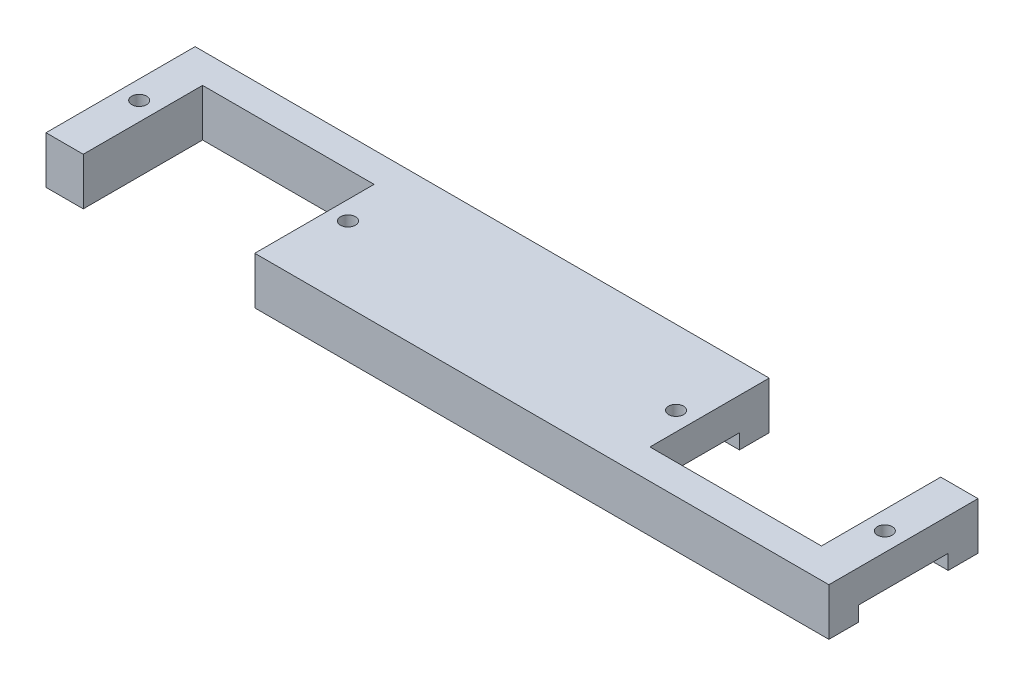
ISO-10303-21;
HEADER;
FILE_DESCRIPTION(('STEP AP214'),'2;1');
FILE_NAME('part.step','',(''),(''),'','','');
FILE_SCHEMA(('AUTOMOTIVE_DESIGN { 1 0 10303 214 1 1 1 1 }'));
ENDSEC;
DATA;
#1=APPLICATION_CONTEXT('core data for automotive mechanical design processes');
#2=APPLICATION_PROTOCOL_DEFINITION('international standard','automotive_design',2000,#1);
#3=PRODUCT_CONTEXT('',#1,'mechanical');
#4=PRODUCT('Part','Part','',(#3));
#5=PRODUCT_RELATED_PRODUCT_CATEGORY('part','',(#4));
#6=PRODUCT_DEFINITION_FORMATION('','',#4);
#7=PRODUCT_DEFINITION_CONTEXT('part definition',#1,'design');
#8=PRODUCT_DEFINITION('design','',#6,#7);
#9=PRODUCT_DEFINITION_SHAPE('','',#8);
#10=(LENGTH_UNIT() NAMED_UNIT(*) SI_UNIT(.MILLI.,.METRE.));
#11=(NAMED_UNIT(*) PLANE_ANGLE_UNIT() SI_UNIT($,.RADIAN.));
#12=(NAMED_UNIT(*) SI_UNIT($,.STERADIAN.) SOLID_ANGLE_UNIT());
#13=UNCERTAINTY_MEASURE_WITH_UNIT(LENGTH_MEASURE(1.E-05),#10,'distance_accuracy_value','');
#14=(GEOMETRIC_REPRESENTATION_CONTEXT(3) GLOBAL_UNCERTAINTY_ASSIGNED_CONTEXT((#13)) GLOBAL_UNIT_ASSIGNED_CONTEXT((#10,
#11,#12)) REPRESENTATION_CONTEXT('',''));
#15=CARTESIAN_POINT('',(0.,0.,0.));
#16=DIRECTION('',(0.,0.,1.));
#17=DIRECTION('',(1.,0.,0.));
#18=AXIS2_PLACEMENT_3D('',#15,#16,#17);
#19=CARTESIAN_POINT('',(0.,0.,0.));
#20=DIRECTION('',(0.,1.,0.));
#21=DIRECTION('',(0.,0.,1.));
#22=AXIS2_PLACEMENT_3D('',#19,#20,#21);
#23=PLANE('',#22);
#24=CARTESIAN_POINT('',(-50.,0.,0.));
#25=DIRECTION('',(0.,1.,0.));
#26=DIRECTION('',(0.,0.,1.));
#27=AXIS2_PLACEMENT_3D('',#24,#25,#26);
#28=CIRCLE('',#27,1.);
#29=CARTESIAN_POINT('',(-50.,0.,1.));
#30=VERTEX_POINT('',#29);
#31=EDGE_CURVE('E620',#30,#30,#28,.T.);
#32=ORIENTED_EDGE('',*,*,#31,.T.);
#33=EDGE_LOOP('',(#32));
#34=FACE_BOUND('',#33,.T.);
#35=CARTESIAN_POINT('',(-22.,0.,0.));
#36=DIRECTION('',(0.,1.,0.));
#37=DIRECTION('',(0.,0.,1.));
#38=AXIS2_PLACEMENT_3D('',#35,#36,#37);
#39=CIRCLE('',#38,0.999999999999997);
#40=CARTESIAN_POINT('',(-22.,0.,0.999999999999997));
#41=VERTEX_POINT('',#40);
#42=EDGE_CURVE('E633',#41,#41,#39,.T.);
#43=ORIENTED_EDGE('',*,*,#42,.T.);
#44=EDGE_LOOP('',(#43));
#45=FACE_BOUND('',#44,.T.);
#46=DIRECTION('',(0.,0.,1.));
#47=VECTOR('',#46,1.);
#48=CARTESIAN_POINT('',(24.5,0.,-10.));
#49=LINE('',#48,#47);
#50=CARTESIAN_POINT('',(24.5,0.,-10.));
#51=VERTEX_POINT('',#50);
#52=CARTESIAN_POINT('',(24.5,0.,-6.));
#53=VERTEX_POINT('',#52);
#54=EDGE_CURVE('E272',#51,#53,#49,.T.);
#55=ORIENTED_EDGE('',*,*,#54,.T.);
#56=DIRECTION('',(1.,0.,0.));
#57=VECTOR('',#56,1.);
#58=CARTESIAN_POINT('',(24.5,0.,-6.));
#59=LINE('',#58,#57);
#60=CARTESIAN_POINT('',(19.5,0.,-6.));
#61=VERTEX_POINT('',#60);
#62=EDGE_CURVE('E190',#61,#53,#59,.T.);
#63=ORIENTED_EDGE('',*,*,#62,.F.);
#64=DIRECTION('',(0.,0.,-1.));
#65=VECTOR('',#64,1.);
#66=CARTESIAN_POINT('',(19.5,0.,6.));
#67=LINE('',#66,#65);
#68=CARTESIAN_POINT('',(19.5,0.,6.));
#69=VERTEX_POINT('',#68);
#70=EDGE_CURVE('E196',#69,#61,#67,.T.);
#71=ORIENTED_EDGE('',*,*,#70,.F.);
#72=DIRECTION('',(1.,0.,0.));
#73=VECTOR('',#72,1.);
#74=CARTESIAN_POINT('',(24.5,0.,6.));
#75=LINE('',#74,#73);
#76=CARTESIAN_POINT('',(52.5,0.,6.));
#77=VERTEX_POINT('',#76);
#78=EDGE_CURVE('E172',#69,#77,#75,.T.);
#79=ORIENTED_EDGE('',*,*,#78,.T.);
#80=DIRECTION('',(0.,0.,-1.));
#81=VECTOR('',#80,1.);
#82=CARTESIAN_POINT('',(52.5,0.,-10.));
#83=LINE('',#82,#81);
#84=CARTESIAN_POINT('',(52.5,0.,10.));
#85=VERTEX_POINT('',#84);
#86=EDGE_CURVE('E321',#85,#77,#83,.T.);
#87=ORIENTED_EDGE('',*,*,#86,.F.);
#88=DIRECTION('',(1.,0.,0.));
#89=VECTOR('',#88,1.);
#90=CARTESIAN_POINT('',(-52.5,0.,10.));
#91=LINE('',#90,#89);
#92=CARTESIAN_POINT('',(-24.5,0.,10.));
#93=VERTEX_POINT('',#92);
#94=EDGE_CURVE('E333',#93,#85,#91,.T.);
#95=ORIENTED_EDGE('',*,*,#94,.F.);
#96=DIRECTION('',(0.,0.,-1.));
#97=VECTOR('',#96,1.);
#98=CARTESIAN_POINT('',(-24.5,0.,10.));
#99=LINE('',#98,#97);
#100=CARTESIAN_POINT('',(-24.5,0.,-6.));
#101=VERTEX_POINT('',#100);
#102=EDGE_CURVE('E240',#93,#101,#99,.T.);
#103=ORIENTED_EDGE('',*,*,#102,.T.);
#104=DIRECTION('',(-1.,0.,0.));
#105=VECTOR('',#104,1.);
#106=CARTESIAN_POINT('',(-47.5,0.,-6.));
#107=LINE('',#106,#105);
#108=CARTESIAN_POINT('',(-47.5,0.,-6.));
#109=VERTEX_POINT('',#108);
#110=EDGE_CURVE('E62',#101,#109,#107,.T.);
#111=ORIENTED_EDGE('',*,*,#110,.T.);
#112=DIRECTION('',(0.,0.,1.));
#113=VECTOR('',#112,1.);
#114=CARTESIAN_POINT('',(-47.5,0.,10.));
#115=LINE('',#114,#113);
#116=CARTESIAN_POINT('',(-47.5,0.,10.));
#117=VERTEX_POINT('',#116);
#118=EDGE_CURVE('E236',#109,#117,#115,.T.);
#119=ORIENTED_EDGE('',*,*,#118,.T.);
#120=CARTESIAN_POINT('',(-52.5,0.,10.));
#121=VERTEX_POINT('',#120);
#122=EDGE_CURVE('E307',#121,#117,#91,.T.);
#123=ORIENTED_EDGE('',*,*,#122,.F.);
#124=DIRECTION('',(0.,0.,1.));
#125=VECTOR('',#124,1.);
#126=CARTESIAN_POINT('',(-52.5,0.,-10.));
#127=LINE('',#126,#125);
#128=CARTESIAN_POINT('',(-52.5,0.,-10.));
#129=VERTEX_POINT('',#128);
#130=EDGE_CURVE('E330',#129,#121,#127,.T.);
#131=ORIENTED_EDGE('',*,*,#130,.F.);
#132=DIRECTION('',(-1.,0.,0.));
#133=VECTOR('',#132,1.);
#134=CARTESIAN_POINT('',(-52.5,0.,-10.));
#135=LINE('',#134,#133);
#136=EDGE_CURVE('E325',#51,#129,#135,.T.);
#137=ORIENTED_EDGE('',*,*,#136,.F.);
#138=EDGE_LOOP('',(#55,#63,#71,#79,#87,#95,#103,#111,#119,#123,#131,#137));
#139=FACE_BOUND('',#138,.T.);
#140=ADVANCED_FACE('F38',(#34,#45,#139),#23,.F.);
#141=CARTESIAN_POINT('',(-52.5,6.35,-10.));
#142=DIRECTION('',(0.,0.,1.));
#143=DIRECTION('',(1.,0.,0.));
#144=AXIS2_PLACEMENT_3D('',#141,#142,#143);
#145=PLANE('',#144);
#146=DIRECTION('',(-1.,0.,0.));
#147=VECTOR('',#146,1.);
#148=CARTESIAN_POINT('',(-52.5,6.35,-10.));
#149=LINE('',#148,#147);
#150=CARTESIAN_POINT('',(24.5,6.35,-10.));
#151=VERTEX_POINT('',#150);
#152=CARTESIAN_POINT('',(-52.5,6.35,-10.));
#153=VERTEX_POINT('',#152);
#154=EDGE_CURVE('E306',#151,#153,#149,.T.);
#155=ORIENTED_EDGE('',*,*,#154,.F.);
#156=DIRECTION('',(0.,1.,0.));
#157=VECTOR('',#156,1.);
#158=CARTESIAN_POINT('',(24.5,0.,-10.));
#159=LINE('',#158,#157);
#160=EDGE_CURVE('E252',#51,#151,#159,.T.);
#161=ORIENTED_EDGE('',*,*,#160,.F.);
#162=ORIENTED_EDGE('',*,*,#136,.T.);
#163=DIRECTION('',(0.,-1.,0.));
#164=VECTOR('',#163,1.);
#165=CARTESIAN_POINT('',(-52.5,6.35,-10.));
#166=LINE('',#165,#164);
#167=EDGE_CURVE('E47',#153,#129,#166,.T.);
#168=ORIENTED_EDGE('',*,*,#167,.F.);
#169=EDGE_LOOP('',(#155,#161,#162,#168));
#170=FACE_BOUND('',#169,.T.);
#171=ADVANCED_FACE('F405',(#170),#145,.F.);
#172=CARTESIAN_POINT('',(-52.5,6.35,10.));
#173=DIRECTION('',(0.,0.,-1.));
#174=DIRECTION('',(-1.,0.,0.));
#175=AXIS2_PLACEMENT_3D('',#172,#173,#174);
#176=PLANE('',#175);
#177=ORIENTED_EDGE('',*,*,#122,.T.);
#178=DIRECTION('',(0.,1.,0.));
#179=VECTOR('',#178,1.);
#180=CARTESIAN_POINT('',(-47.5,0.,10.));
#181=LINE('',#180,#179);
#182=CARTESIAN_POINT('',(-47.5,6.35,10.));
#183=VERTEX_POINT('',#182);
#184=EDGE_CURVE('E247',#117,#183,#181,.T.);
#185=ORIENTED_EDGE('',*,*,#184,.T.);
#186=DIRECTION('',(1.,0.,0.));
#187=VECTOR('',#186,1.);
#188=CARTESIAN_POINT('',(-52.5,6.35,10.));
#189=LINE('',#188,#187);
#190=CARTESIAN_POINT('',(-52.5,6.35,10.));
#191=VERTEX_POINT('',#190);
#192=EDGE_CURVE('E316',#191,#183,#189,.T.);
#193=ORIENTED_EDGE('',*,*,#192,.F.);
#194=DIRECTION('',(0.,-1.,0.));
#195=VECTOR('',#194,1.);
#196=CARTESIAN_POINT('',(-52.5,6.35,10.));
#197=LINE('',#196,#195);
#198=EDGE_CURVE('E340',#191,#121,#197,.T.);
#199=ORIENTED_EDGE('',*,*,#198,.T.);
#200=EDGE_LOOP('',(#177,#185,#193,#199));
#201=FACE_BOUND('',#200,.T.);
#202=ADVANCED_FACE('F358',(#201),#176,.F.);
#203=CARTESIAN_POINT('',(52.5,6.35,-10.));
#204=DIRECTION('',(-1.,0.,0.));
#205=DIRECTION('',(0.,0.,1.));
#206=AXIS2_PLACEMENT_3D('',#203,#204,#205);
#207=PLANE('',#206);
#208=ORIENTED_EDGE('',*,*,#86,.T.);
#209=DIRECTION('',(0.,-1.,0.));
#210=VECTOR('',#209,1.);
#211=CARTESIAN_POINT('',(52.5,2.,6.));
#212=LINE('',#211,#210);
#213=CARTESIAN_POINT('',(52.5,2.,6.));
#214=VERTEX_POINT('',#213);
#215=EDGE_CURVE('E199',#214,#77,#212,.T.);
#216=ORIENTED_EDGE('',*,*,#215,.F.);
#217=DIRECTION('',(0.,0.,1.));
#218=VECTOR('',#217,1.);
#219=CARTESIAN_POINT('',(52.5,2.,6.));
#220=LINE('',#219,#218);
#221=CARTESIAN_POINT('',(52.5,2.,-6.));
#222=VERTEX_POINT('',#221);
#223=EDGE_CURVE('E218',#222,#214,#220,.T.);
#224=ORIENTED_EDGE('',*,*,#223,.F.);
#225=DIRECTION('',(0.,-1.,0.));
#226=VECTOR('',#225,1.);
#227=CARTESIAN_POINT('',(52.5,2.,-6.));
#228=LINE('',#227,#226);
#229=CARTESIAN_POINT('',(52.5,0.,-6.));
#230=VERTEX_POINT('',#229);
#231=EDGE_CURVE('E230',#222,#230,#228,.T.);
#232=ORIENTED_EDGE('',*,*,#231,.T.);
#233=CARTESIAN_POINT('',(52.5,0.,-10.));
#234=VERTEX_POINT('',#233);
#235=EDGE_CURVE('E262',#230,#234,#83,.T.);
#236=ORIENTED_EDGE('',*,*,#235,.T.);
#237=DIRECTION('',(0.,-1.,0.));
#238=VECTOR('',#237,1.);
#239=CARTESIAN_POINT('',(52.5,6.35,-10.));
#240=LINE('',#239,#238);
#241=CARTESIAN_POINT('',(52.5,6.35,-10.));
#242=VERTEX_POINT('',#241);
#243=EDGE_CURVE('E11',#242,#234,#240,.T.);
#244=ORIENTED_EDGE('',*,*,#243,.F.);
#245=DIRECTION('',(0.,0.,-1.));
#246=VECTOR('',#245,1.);
#247=CARTESIAN_POINT('',(52.5,6.35,-10.));
#248=LINE('',#247,#246);
#249=CARTESIAN_POINT('',(52.5,6.35,10.));
#250=VERTEX_POINT('',#249);
#251=EDGE_CURVE('E302',#250,#242,#248,.T.);
#252=ORIENTED_EDGE('',*,*,#251,.F.);
#253=DIRECTION('',(0.,-1.,0.));
#254=VECTOR('',#253,1.);
#255=CARTESIAN_POINT('',(52.5,6.35,10.));
#256=LINE('',#255,#254);
#257=EDGE_CURVE('E320',#250,#85,#256,.T.);
#258=ORIENTED_EDGE('',*,*,#257,.T.);
#259=EDGE_LOOP('',(#208,#216,#224,#232,#236,#244,#252,#258));
#260=FACE_BOUND('',#259,.T.);
#261=ADVANCED_FACE('F40',(#260),#207,.F.);
#262=CARTESIAN_POINT('',(47.5,0.,-10.));
#263=VERTEX_POINT('',#262);
#264=EDGE_CURVE('E326',#234,#263,#135,.T.);
#265=ORIENTED_EDGE('',*,*,#264,.T.);
#266=DIRECTION('',(0.,1.,0.));
#267=VECTOR('',#266,1.);
#268=CARTESIAN_POINT('',(47.5,0.,-10.));
#269=LINE('',#268,#267);
#270=CARTESIAN_POINT('',(47.5,6.35,-10.));
#271=VERTEX_POINT('',#270);
#272=EDGE_CURVE('E293',#263,#271,#269,.T.);
#273=ORIENTED_EDGE('',*,*,#272,.T.);
#274=EDGE_CURVE('E308',#242,#271,#149,.T.);
#275=ORIENTED_EDGE('',*,*,#274,.F.);
#276=ORIENTED_EDGE('',*,*,#243,.T.);
#277=EDGE_LOOP('',(#265,#273,#275,#276));
#278=FACE_BOUND('',#277,.T.);
#279=ADVANCED_FACE('F383',(#278),#145,.F.);
#280=CARTESIAN_POINT('',(-52.5,6.35,-10.));
#281=DIRECTION('',(1.,0.,0.));
#282=DIRECTION('',(0.,0.,-1.));
#283=AXIS2_PLACEMENT_3D('',#280,#281,#282);
#284=PLANE('',#283);
#285=ORIENTED_EDGE('',*,*,#130,.T.);
#286=ORIENTED_EDGE('',*,*,#198,.F.);
#287=DIRECTION('',(0.,0.,1.));
#288=VECTOR('',#287,1.);
#289=CARTESIAN_POINT('',(-52.5,6.35,-10.));
#290=LINE('',#289,#288);
#291=EDGE_CURVE('E312',#153,#191,#290,.T.);
#292=ORIENTED_EDGE('',*,*,#291,.F.);
#293=ORIENTED_EDGE('',*,*,#167,.T.);
#294=EDGE_LOOP('',(#285,#286,#292,#293));
#295=FACE_BOUND('',#294,.T.);
#296=ADVANCED_FACE('F349',(#295),#284,.F.);
#297=CARTESIAN_POINT('',(-24.5,6.35,10.));
#298=VERTEX_POINT('',#297);
#299=EDGE_CURVE('E315',#298,#250,#189,.T.);
#300=ORIENTED_EDGE('',*,*,#299,.F.);
#301=DIRECTION('',(0.,1.,0.));
#302=VECTOR('',#301,1.);
#303=CARTESIAN_POINT('',(-24.5,0.,10.));
#304=LINE('',#303,#302);
#305=EDGE_CURVE('E266',#93,#298,#304,.T.);
#306=ORIENTED_EDGE('',*,*,#305,.F.);
#307=ORIENTED_EDGE('',*,*,#94,.T.);
#308=ORIENTED_EDGE('',*,*,#257,.F.);
#309=EDGE_LOOP('',(#300,#306,#307,#308));
#310=FACE_BOUND('',#309,.T.);
#311=ADVANCED_FACE('F412',(#310),#176,.F.);
#312=CARTESIAN_POINT('',(0.,6.35,0.));
#313=DIRECTION('',(0.,1.,0.));
#314=DIRECTION('',(0.,0.,1.));
#315=AXIS2_PLACEMENT_3D('',#312,#313,#314);
#316=PLANE('',#315);
#317=CARTESIAN_POINT('',(-50.,6.35,0.));
#318=DIRECTION('',(0.,1.,0.));
#319=DIRECTION('',(0.,0.,1.));
#320=AXIS2_PLACEMENT_3D('',#317,#318,#319);
#321=CIRCLE('',#320,1.);
#322=CARTESIAN_POINT('',(-50.,6.35,1.));
#323=VERTEX_POINT('',#322);
#324=EDGE_CURVE('E623',#323,#323,#321,.T.);
#325=ORIENTED_EDGE('',*,*,#324,.F.);
#326=EDGE_LOOP('',(#325));
#327=FACE_BOUND('',#326,.T.);
#328=CARTESIAN_POINT('',(-22.,6.35,0.));
#329=DIRECTION('',(0.,1.,0.));
#330=DIRECTION('',(0.,0.,1.));
#331=AXIS2_PLACEMENT_3D('',#328,#329,#330);
#332=CIRCLE('',#331,1.);
#333=CARTESIAN_POINT('',(-22.,6.35,1.));
#334=VERTEX_POINT('',#333);
#335=EDGE_CURVE('E627',#334,#334,#332,.T.);
#336=ORIENTED_EDGE('',*,*,#335,.F.);
#337=EDGE_LOOP('',(#336));
#338=FACE_BOUND('',#337,.T.);
#339=CARTESIAN_POINT('',(22.,6.35,0.));
#340=DIRECTION('',(0.,1.,0.));
#341=DIRECTION('',(0.,0.,1.));
#342=AXIS2_PLACEMENT_3D('',#339,#340,#341);
#343=CIRCLE('',#342,1.);
#344=CARTESIAN_POINT('',(22.,6.35,1.));
#345=VERTEX_POINT('',#344);
#346=EDGE_CURVE('E637',#345,#345,#343,.T.);
#347=ORIENTED_EDGE('',*,*,#346,.F.);
#348=EDGE_LOOP('',(#347));
#349=FACE_BOUND('',#348,.T.);
#350=CARTESIAN_POINT('',(50.,6.35,0.));
#351=DIRECTION('',(0.,1.,0.));
#352=DIRECTION('',(0.,0.,1.));
#353=AXIS2_PLACEMENT_3D('',#350,#351,#352);
#354=CIRCLE('',#353,1.);
#355=CARTESIAN_POINT('',(50.,6.35,1.));
#356=VERTEX_POINT('',#355);
#357=EDGE_CURVE('E645',#356,#356,#354,.T.);
#358=ORIENTED_EDGE('',*,*,#357,.F.);
#359=EDGE_LOOP('',(#358));
#360=FACE_BOUND('',#359,.T.);
#361=DIRECTION('',(0.,0.,1.));
#362=VECTOR('',#361,1.);
#363=CARTESIAN_POINT('',(-47.5,6.35,10.));
#364=LINE('',#363,#362);
#365=CARTESIAN_POINT('',(-47.5,6.35,-6.));
#366=VERTEX_POINT('',#365);
#367=EDGE_CURVE('E248',#366,#183,#364,.T.);
#368=ORIENTED_EDGE('',*,*,#367,.F.);
#369=DIRECTION('',(-1.,0.,0.));
#370=VECTOR('',#369,1.);
#371=CARTESIAN_POINT('',(-47.5,6.35,-6.));
#372=LINE('',#371,#370);
#373=CARTESIAN_POINT('',(-24.5,6.35,-6.));
#374=VERTEX_POINT('',#373);
#375=EDGE_CURVE('E241',#374,#366,#372,.T.);
#376=ORIENTED_EDGE('',*,*,#375,.F.);
#377=DIRECTION('',(0.,0.,-1.));
#378=VECTOR('',#377,1.);
#379=CARTESIAN_POINT('',(-24.5,6.35,10.));
#380=LINE('',#379,#378);
#381=EDGE_CURVE('E251',#298,#374,#380,.T.);
#382=ORIENTED_EDGE('',*,*,#381,.F.);
#383=ORIENTED_EDGE('',*,*,#299,.T.);
#384=ORIENTED_EDGE('',*,*,#251,.T.);
#385=ORIENTED_EDGE('',*,*,#274,.T.);
#386=DIRECTION('',(0.,0.,-1.));
#387=VECTOR('',#386,1.);
#388=CARTESIAN_POINT('',(47.5,6.35,-10.));
#389=LINE('',#388,#387);
#390=CARTESIAN_POINT('',(47.5,6.35,6.));
#391=VERTEX_POINT('',#390);
#392=EDGE_CURVE('E276',#391,#271,#389,.T.);
#393=ORIENTED_EDGE('',*,*,#392,.F.);
#394=DIRECTION('',(1.,0.,0.));
#395=VECTOR('',#394,1.);
#396=CARTESIAN_POINT('',(24.5,6.35,6.));
#397=LINE('',#396,#395);
#398=CARTESIAN_POINT('',(24.5,6.35,6.));
#399=VERTEX_POINT('',#398);
#400=EDGE_CURVE('E286',#399,#391,#397,.T.);
#401=ORIENTED_EDGE('',*,*,#400,.F.);
#402=DIRECTION('',(0.,0.,1.));
#403=VECTOR('',#402,1.);
#404=CARTESIAN_POINT('',(24.5,6.35,-10.));
#405=LINE('',#404,#403);
#406=EDGE_CURVE('E206',#151,#399,#405,.T.);
#407=ORIENTED_EDGE('',*,*,#406,.F.);
#408=ORIENTED_EDGE('',*,*,#154,.T.);
#409=ORIENTED_EDGE('',*,*,#291,.T.);
#410=ORIENTED_EDGE('',*,*,#192,.T.);
#411=EDGE_LOOP('',(#368,#376,#382,#383,#384,#385,#393,#401,#407,#408,#409,#410));
#412=FACE_BOUND('',#411,.T.);
#413=ADVANCED_FACE('F362',(#327,#338,#349,#360,#412),#316,.T.);
#414=ORIENTED_EDGE('',*,*,#235,.F.);
#415=DIRECTION('',(1.,0.,0.));
#416=VECTOR('',#415,1.);
#417=CARTESIAN_POINT('',(47.5,0.,-6.));
#418=LINE('',#417,#416);
#419=CARTESIAN_POINT('',(47.5,0.,-6.));
#420=VERTEX_POINT('',#419);
#421=EDGE_CURVE('E214',#420,#230,#418,.T.);
#422=ORIENTED_EDGE('',*,*,#421,.F.);
#423=DIRECTION('',(0.,0.,-1.));
#424=VECTOR('',#423,1.);
#425=CARTESIAN_POINT('',(47.5,0.,-10.));
#426=LINE('',#425,#424);
#427=EDGE_CURVE('E279',#420,#263,#426,.T.);
#428=ORIENTED_EDGE('',*,*,#427,.T.);
#429=ORIENTED_EDGE('',*,*,#264,.F.);
#430=EDGE_LOOP('',(#414,#422,#428,#429));
#431=FACE_BOUND('',#430,.T.);
#432=ADVANCED_FACE('F379',(#431),#23,.F.);
#433=CARTESIAN_POINT('',(24.5,0.,-10.));
#434=DIRECTION('',(-1.,0.,0.));
#435=DIRECTION('',(0.,0.,1.));
#436=AXIS2_PLACEMENT_3D('',#433,#434,#435);
#437=PLANE('',#436);
#438=DIRECTION('',(0.,0.,1.));
#439=VECTOR('',#438,1.);
#440=CARTESIAN_POINT('',(24.5,2.,6.));
#441=LINE('',#440,#439);
#442=CARTESIAN_POINT('',(24.5,2.,-6.));
#443=VERTEX_POINT('',#442);
#444=CARTESIAN_POINT('',(24.5,2.,6.));
#445=VERTEX_POINT('',#444);
#446=EDGE_CURVE('E54',#443,#445,#441,.T.);
#447=ORIENTED_EDGE('',*,*,#446,.F.);
#448=DIRECTION('',(0.,-1.,0.));
#449=VECTOR('',#448,1.);
#450=CARTESIAN_POINT('',(24.5,2.,-6.));
#451=LINE('',#450,#449);
#452=EDGE_CURVE('E202',#443,#53,#451,.T.);
#453=ORIENTED_EDGE('',*,*,#452,.T.);
#454=ORIENTED_EDGE('',*,*,#54,.F.);
#455=ORIENTED_EDGE('',*,*,#160,.T.);
#456=ORIENTED_EDGE('',*,*,#406,.T.);
#457=DIRECTION('',(0.,1.,0.));
#458=VECTOR('',#457,1.);
#459=CARTESIAN_POINT('',(24.5,0.,6.));
#460=LINE('',#459,#458);
#461=EDGE_CURVE('E282',#445,#399,#460,.T.);
#462=ORIENTED_EDGE('',*,*,#461,.F.);
#463=EDGE_LOOP('',(#447,#453,#454,#455,#456,#462));
#464=FACE_BOUND('',#463,.T.);
#465=ADVANCED_FACE('F404',(#464),#437,.F.);
#466=CARTESIAN_POINT('',(47.5,0.,-10.));
#467=DIRECTION('',(1.,0.,0.));
#468=DIRECTION('',(0.,0.,-1.));
#469=AXIS2_PLACEMENT_3D('',#466,#467,#468);
#470=PLANE('',#469);
#471=ORIENTED_EDGE('',*,*,#427,.F.);
#472=DIRECTION('',(0.,-1.,0.));
#473=VECTOR('',#472,1.);
#474=CARTESIAN_POINT('',(47.5,2.,-6.));
#475=LINE('',#474,#473);
#476=CARTESIAN_POINT('',(47.5,2.,-6.));
#477=VERTEX_POINT('',#476);
#478=EDGE_CURVE('E224',#477,#420,#475,.T.);
#479=ORIENTED_EDGE('',*,*,#478,.F.);
#480=DIRECTION('',(0.,0.,-1.));
#481=VECTOR('',#480,1.);
#482=CARTESIAN_POINT('',(47.5,2.,6.));
#483=LINE('',#482,#481);
#484=CARTESIAN_POINT('',(47.5,2.,6.));
#485=VERTEX_POINT('',#484);
#486=EDGE_CURVE('E209',#485,#477,#483,.T.);
#487=ORIENTED_EDGE('',*,*,#486,.F.);
#488=DIRECTION('',(0.,1.,0.));
#489=VECTOR('',#488,1.);
#490=CARTESIAN_POINT('',(47.5,0.,6.));
#491=LINE('',#490,#489);
#492=EDGE_CURVE('E297',#485,#391,#491,.T.);
#493=ORIENTED_EDGE('',*,*,#492,.T.);
#494=ORIENTED_EDGE('',*,*,#392,.T.);
#495=ORIENTED_EDGE('',*,*,#272,.F.);
#496=EDGE_LOOP('',(#471,#479,#487,#493,#494,#495));
#497=FACE_BOUND('',#496,.T.);
#498=ADVANCED_FACE('F402',(#497),#470,.F.);
#499=CARTESIAN_POINT('',(24.5,0.,6.));
#500=DIRECTION('',(0.,0.,1.));
#501=DIRECTION('',(1.,0.,0.));
#502=AXIS2_PLACEMENT_3D('',#499,#500,#501);
#503=PLANE('',#502);
#504=ORIENTED_EDGE('',*,*,#400,.T.);
#505=ORIENTED_EDGE('',*,*,#492,.F.);
#506=DIRECTION('',(-1.,0.,0.));
#507=VECTOR('',#506,1.);
#508=CARTESIAN_POINT('',(47.5,2.,6.));
#509=LINE('',#508,#507);
#510=EDGE_CURVE('E221',#214,#485,#509,.T.);
#511=ORIENTED_EDGE('',*,*,#510,.F.);
#512=ORIENTED_EDGE('',*,*,#215,.T.);
#513=ORIENTED_EDGE('',*,*,#78,.F.);
#514=DIRECTION('',(0.,-1.,0.));
#515=VECTOR('',#514,1.);
#516=CARTESIAN_POINT('',(19.5,2.,6.));
#517=LINE('',#516,#515);
#518=CARTESIAN_POINT('',(19.5,2.,6.));
#519=VERTEX_POINT('',#518);
#520=EDGE_CURVE('E165',#519,#69,#517,.T.);
#521=ORIENTED_EDGE('',*,*,#520,.F.);
#522=DIRECTION('',(-1.,0.,0.));
#523=VECTOR('',#522,1.);
#524=CARTESIAN_POINT('',(24.5,2.,6.));
#525=LINE('',#524,#523);
#526=EDGE_CURVE('E169',#445,#519,#525,.T.);
#527=ORIENTED_EDGE('',*,*,#526,.F.);
#528=ORIENTED_EDGE('',*,*,#461,.T.);
#529=EDGE_LOOP('',(#504,#505,#511,#512,#513,#521,#527,#528));
#530=FACE_BOUND('',#529,.T.);
#531=ADVANCED_FACE('F168',(#530),#503,.F.);
#532=CARTESIAN_POINT('',(-47.5,0.,10.));
#533=DIRECTION('',(-1.,0.,0.));
#534=DIRECTION('',(0.,0.,1.));
#535=AXIS2_PLACEMENT_3D('',#532,#533,#534);
#536=PLANE('',#535);
#537=ORIENTED_EDGE('',*,*,#367,.T.);
#538=ORIENTED_EDGE('',*,*,#184,.F.);
#539=ORIENTED_EDGE('',*,*,#118,.F.);
#540=DIRECTION('',(0.,1.,0.));
#541=VECTOR('',#540,1.);
#542=CARTESIAN_POINT('',(-47.5,0.,-6.));
#543=LINE('',#542,#541);
#544=EDGE_CURVE('E259',#109,#366,#543,.T.);
#545=ORIENTED_EDGE('',*,*,#544,.T.);
#546=EDGE_LOOP('',(#537,#538,#539,#545));
#547=FACE_BOUND('',#546,.T.);
#548=ADVANCED_FACE('F463',(#547),#536,.F.);
#549=CARTESIAN_POINT('',(-47.5,0.,-6.));
#550=DIRECTION('',(0.,0.,-1.));
#551=DIRECTION('',(-1.,0.,0.));
#552=AXIS2_PLACEMENT_3D('',#549,#550,#551);
#553=PLANE('',#552);
#554=ORIENTED_EDGE('',*,*,#375,.T.);
#555=ORIENTED_EDGE('',*,*,#544,.F.);
#556=ORIENTED_EDGE('',*,*,#110,.F.);
#557=DIRECTION('',(0.,1.,0.));
#558=VECTOR('',#557,1.);
#559=CARTESIAN_POINT('',(-24.5,0.,-6.));
#560=LINE('',#559,#558);
#561=EDGE_CURVE('E263',#101,#374,#560,.T.);
#562=ORIENTED_EDGE('',*,*,#561,.T.);
#563=EDGE_LOOP('',(#554,#555,#556,#562));
#564=FACE_BOUND('',#563,.T.);
#565=ADVANCED_FACE('F563',(#564),#553,.F.);
#566=CARTESIAN_POINT('',(-24.5,0.,10.));
#567=DIRECTION('',(1.,0.,0.));
#568=DIRECTION('',(0.,0.,-1.));
#569=AXIS2_PLACEMENT_3D('',#566,#567,#568);
#570=PLANE('',#569);
#571=ORIENTED_EDGE('',*,*,#381,.T.);
#572=ORIENTED_EDGE('',*,*,#561,.F.);
#573=ORIENTED_EDGE('',*,*,#102,.F.);
#574=ORIENTED_EDGE('',*,*,#305,.T.);
#575=EDGE_LOOP('',(#571,#572,#573,#574));
#576=FACE_BOUND('',#575,.T.);
#577=ADVANCED_FACE('F429',(#576),#570,.F.);
#578=CARTESIAN_POINT('',(47.5,2.,-6.));
#579=DIRECTION('',(0.,0.,-1.));
#580=DIRECTION('',(-1.,0.,0.));
#581=AXIS2_PLACEMENT_3D('',#578,#579,#580);
#582=PLANE('',#581);
#583=ORIENTED_EDGE('',*,*,#421,.T.);
#584=ORIENTED_EDGE('',*,*,#231,.F.);
#585=DIRECTION('',(1.,0.,0.));
#586=VECTOR('',#585,1.);
#587=CARTESIAN_POINT('',(47.5,2.,-6.));
#588=LINE('',#587,#586);
#589=EDGE_CURVE('E213',#477,#222,#588,.T.);
#590=ORIENTED_EDGE('',*,*,#589,.F.);
#591=ORIENTED_EDGE('',*,*,#478,.T.);
#592=EDGE_LOOP('',(#583,#584,#590,#591));
#593=FACE_BOUND('',#592,.T.);
#594=ADVANCED_FACE('F400',(#593),#582,.F.);
#595=CARTESIAN_POINT('',(0.,2.,0.));
#596=DIRECTION('',(0.,-1.,0.));
#597=DIRECTION('',(0.,0.,-1.));
#598=AXIS2_PLACEMENT_3D('',#595,#596,#597);
#599=PLANE('',#598);
#600=CARTESIAN_POINT('',(50.,2.,0.));
#601=DIRECTION('',(0.,-1.,0.));
#602=DIRECTION('',(0.,0.,-1.));
#603=AXIS2_PLACEMENT_3D('',#600,#601,#602);
#604=CIRCLE('',#603,1.);
#605=CARTESIAN_POINT('',(50.,2.,-1.));
#606=VERTEX_POINT('',#605);
#607=EDGE_CURVE('E227',#606,#606,#604,.T.);
#608=ORIENTED_EDGE('',*,*,#607,.F.);
#609=EDGE_LOOP('',(#608));
#610=FACE_BOUND('',#609,.T.);
#611=ORIENTED_EDGE('',*,*,#486,.T.);
#612=ORIENTED_EDGE('',*,*,#589,.T.);
#613=ORIENTED_EDGE('',*,*,#223,.T.);
#614=ORIENTED_EDGE('',*,*,#510,.T.);
#615=EDGE_LOOP('',(#611,#612,#613,#614));
#616=FACE_BOUND('',#615,.T.);
#617=ADVANCED_FACE('F396',(#610,#616),#599,.T.);
#618=CARTESIAN_POINT('',(24.5,2.,-6.));
#619=DIRECTION('',(0.,0.,-1.));
#620=DIRECTION('',(-1.,0.,0.));
#621=AXIS2_PLACEMENT_3D('',#618,#619,#620);
#622=PLANE('',#621);
#623=ORIENTED_EDGE('',*,*,#62,.T.);
#624=ORIENTED_EDGE('',*,*,#452,.F.);
#625=DIRECTION('',(1.,0.,0.));
#626=VECTOR('',#625,1.);
#627=CARTESIAN_POINT('',(24.5,2.,-6.));
#628=LINE('',#627,#626);
#629=CARTESIAN_POINT('',(19.5,2.,-6.));
#630=VERTEX_POINT('',#629);
#631=EDGE_CURVE('E178',#630,#443,#628,.T.);
#632=ORIENTED_EDGE('',*,*,#631,.F.);
#633=DIRECTION('',(0.,-1.,0.));
#634=VECTOR('',#633,1.);
#635=CARTESIAN_POINT('',(19.5,2.,-6.));
#636=LINE('',#635,#634);
#637=EDGE_CURVE('E177',#630,#61,#636,.T.);
#638=ORIENTED_EDGE('',*,*,#637,.T.);
#639=EDGE_LOOP('',(#623,#624,#632,#638));
#640=FACE_BOUND('',#639,.T.);
#641=ADVANCED_FACE('F480',(#640),#622,.F.);
#642=CARTESIAN_POINT('',(19.5,2.,6.));
#643=DIRECTION('',(-1.,0.,0.));
#644=DIRECTION('',(0.,0.,1.));
#645=AXIS2_PLACEMENT_3D('',#642,#643,#644);
#646=PLANE('',#645);
#647=ORIENTED_EDGE('',*,*,#70,.T.);
#648=ORIENTED_EDGE('',*,*,#637,.F.);
#649=DIRECTION('',(0.,0.,-1.));
#650=VECTOR('',#649,1.);
#651=CARTESIAN_POINT('',(19.5,2.,6.));
#652=LINE('',#651,#650);
#653=EDGE_CURVE('E181',#519,#630,#652,.T.);
#654=ORIENTED_EDGE('',*,*,#653,.F.);
#655=ORIENTED_EDGE('',*,*,#520,.T.);
#656=EDGE_LOOP('',(#647,#648,#654,#655));
#657=FACE_BOUND('',#656,.T.);
#658=ADVANCED_FACE('F182',(#657),#646,.F.);
#659=CARTESIAN_POINT('',(0.,2.,0.));
#660=DIRECTION('',(0.,1.,0.));
#661=DIRECTION('',(0.,0.,1.));
#662=AXIS2_PLACEMENT_3D('',#659,#660,#661);
#663=PLANE('',#662);
#664=CARTESIAN_POINT('',(22.,2.,0.));
#665=DIRECTION('',(0.,1.,0.));
#666=DIRECTION('',(0.,0.,1.));
#667=AXIS2_PLACEMENT_3D('',#664,#665,#666);
#668=CIRCLE('',#667,0.999999999999999);
#669=CARTESIAN_POINT('',(22.,2.,0.999999999999999));
#670=VERTEX_POINT('',#669);
#671=EDGE_CURVE('E641',#670,#670,#668,.T.);
#672=ORIENTED_EDGE('',*,*,#671,.T.);
#673=EDGE_LOOP('',(#672));
#674=FACE_BOUND('',#673,.T.);
#675=ORIENTED_EDGE('',*,*,#446,.T.);
#676=ORIENTED_EDGE('',*,*,#526,.T.);
#677=ORIENTED_EDGE('',*,*,#653,.T.);
#678=ORIENTED_EDGE('',*,*,#631,.T.);
#679=EDGE_LOOP('',(#675,#676,#677,#678));
#680=FACE_BOUND('',#679,.T.);
#681=ADVANCED_FACE('F186',(#674,#680),#663,.F.);
#682=CARTESIAN_POINT('',(50.,6.35,0.));
#683=DIRECTION('',(0.,1.,0.));
#684=DIRECTION('',(0.,0.,1.));
#685=AXIS2_PLACEMENT_3D('',#682,#683,#684);
#686=CYLINDRICAL_SURFACE('',#685,1.);
#687=ORIENTED_EDGE('',*,*,#607,.T.);
#688=EDGE_LOOP('',(#687));
#689=FACE_BOUND('',#688,.T.);
#690=ORIENTED_EDGE('',*,*,#357,.T.);
#691=EDGE_LOOP('',(#690));
#692=FACE_BOUND('',#691,.T.);
#693=ADVANCED_FACE('F518',(#689,#692),#686,.F.);
#694=CARTESIAN_POINT('',(22.,6.35,0.));
#695=DIRECTION('',(0.,1.,0.));
#696=DIRECTION('',(0.,0.,1.));
#697=AXIS2_PLACEMENT_3D('',#694,#695,#696);
#698=CYLINDRICAL_SURFACE('',#697,0.999999999999999);
#699=ORIENTED_EDGE('',*,*,#346,.T.);
#700=EDGE_LOOP('',(#699));
#701=FACE_BOUND('',#700,.T.);
#702=ORIENTED_EDGE('',*,*,#671,.F.);
#703=EDGE_LOOP('',(#702));
#704=FACE_BOUND('',#703,.T.);
#705=ADVANCED_FACE('F526',(#701,#704),#698,.F.);
#706=CARTESIAN_POINT('',(-22.,6.35,0.));
#707=DIRECTION('',(0.,1.,0.));
#708=DIRECTION('',(0.,0.,1.));
#709=AXIS2_PLACEMENT_3D('',#706,#707,#708);
#710=CYLINDRICAL_SURFACE('',#709,0.999999999999999);
#711=ORIENTED_EDGE('',*,*,#42,.F.);
#712=EDGE_LOOP('',(#711));
#713=FACE_BOUND('',#712,.T.);
#714=ORIENTED_EDGE('',*,*,#335,.T.);
#715=EDGE_LOOP('',(#714));
#716=FACE_BOUND('',#715,.T.);
#717=ADVANCED_FACE('F536',(#713,#716),#710,.F.);
#718=CARTESIAN_POINT('',(-50.,6.35,0.));
#719=DIRECTION('',(0.,1.,0.));
#720=DIRECTION('',(0.,0.,1.));
#721=AXIS2_PLACEMENT_3D('',#718,#719,#720);
#722=CYLINDRICAL_SURFACE('',#721,1.);
#723=ORIENTED_EDGE('',*,*,#31,.F.);
#724=EDGE_LOOP('',(#723));
#725=FACE_BOUND('',#724,.T.);
#726=ORIENTED_EDGE('',*,*,#324,.T.);
#727=EDGE_LOOP('',(#726));
#728=FACE_BOUND('',#727,.T.);
#729=ADVANCED_FACE('F546',(#725,#728),#722,.F.);
#730=CLOSED_SHELL('',(#140,#171,#202,#261,#279,#296,#311,#413,#432,#465,#498,#531,#548,#565,
#577,#594,#617,#641,#658,#681,#693,#705,#717,#729));
#731=MANIFOLD_SOLID_BREP('B2',#730);
#732=ADVANCED_BREP_SHAPE_REPRESENTATION('',(#18,#731),#14);
#733=SHAPE_DEFINITION_REPRESENTATION(#9,#732);
ENDSEC;
END-ISO-10303-21;
